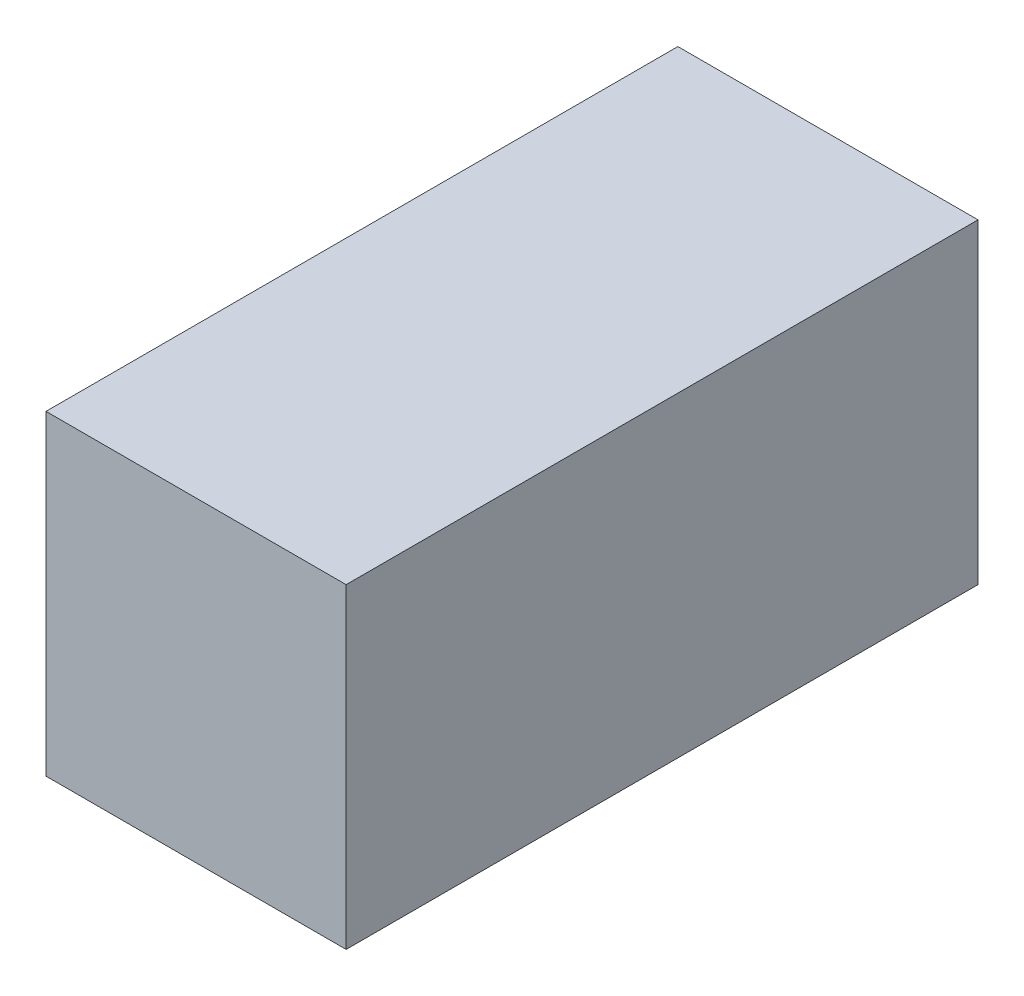
ISO-10303-21;
HEADER;
FILE_DESCRIPTION(('STEP AP214'),'2;1');
FILE_NAME('part.step','',(''),(''),'','','');
FILE_SCHEMA(('AUTOMOTIVE_DESIGN { 1 0 10303 214 1 1 1 1 }'));
ENDSEC;
DATA;
#1=APPLICATION_CONTEXT('core data for automotive mechanical design processes');
#2=APPLICATION_PROTOCOL_DEFINITION('international standard','automotive_design',2000,#1);
#3=PRODUCT_CONTEXT('',#1,'mechanical');
#4=PRODUCT('Part','Part','',(#3));
#5=PRODUCT_RELATED_PRODUCT_CATEGORY('part','',(#4));
#6=PRODUCT_DEFINITION_FORMATION('','',#4);
#7=PRODUCT_DEFINITION_CONTEXT('part definition',#1,'design');
#8=PRODUCT_DEFINITION('design','',#6,#7);
#9=PRODUCT_DEFINITION_SHAPE('','',#8);
#10=(LENGTH_UNIT() NAMED_UNIT(*) SI_UNIT(.MILLI.,.METRE.));
#11=(NAMED_UNIT(*) PLANE_ANGLE_UNIT() SI_UNIT($,.RADIAN.));
#12=(NAMED_UNIT(*) SI_UNIT($,.STERADIAN.) SOLID_ANGLE_UNIT());
#13=UNCERTAINTY_MEASURE_WITH_UNIT(LENGTH_MEASURE(1.E-05),#10,'distance_accuracy_value','');
#14=(GEOMETRIC_REPRESENTATION_CONTEXT(3) GLOBAL_UNCERTAINTY_ASSIGNED_CONTEXT((#13)) GLOBAL_UNIT_ASSIGNED_CONTEXT((#10,
#11,#12)) REPRESENTATION_CONTEXT('',''));
#15=CARTESIAN_POINT('',(0.,0.,0.));
#16=DIRECTION('',(0.,0.,1.));
#17=DIRECTION('',(1.,0.,0.));
#18=AXIS2_PLACEMENT_3D('',#15,#16,#17);
#19=CARTESIAN_POINT('',(-19.,0.,0.));
#20=DIRECTION('',(0.,0.,1.));
#21=DIRECTION('',(1.,0.,0.));
#22=AXIS2_PLACEMENT_3D('',#19,#20,#21);
#23=PLANE('',#22);
#24=DIRECTION('',(0.,-1.,0.));
#25=VECTOR('',#24,1.);
#26=CARTESIAN_POINT('',(0.,0.,0.));
#27=LINE('',#26,#25);
#28=CARTESIAN_POINT('',(0.,20.,0.));
#29=VERTEX_POINT('',#28);
#30=CARTESIAN_POINT('',(0.,0.,0.));
#31=VERTEX_POINT('',#30);
#32=EDGE_CURVE('E104',#29,#31,#27,.T.);
#33=ORIENTED_EDGE('',*,*,#32,.F.);
#34=DIRECTION('',(1.,0.,0.));
#35=VECTOR('',#34,1.);
#36=CARTESIAN_POINT('',(-19.,20.,0.));
#37=LINE('',#36,#35);
#38=CARTESIAN_POINT('',(-19.,20.,0.));
#39=VERTEX_POINT('',#38);
#40=EDGE_CURVE('E11',#39,#29,#37,.T.);
#41=ORIENTED_EDGE('',*,*,#40,.F.);
#42=DIRECTION('',(0.,-1.,0.));
#43=VECTOR('',#42,1.);
#44=CARTESIAN_POINT('',(-19.,0.,0.));
#45=LINE('',#44,#43);
#46=CARTESIAN_POINT('',(-19.,0.,0.));
#47=VERTEX_POINT('',#46);
#48=EDGE_CURVE('E100',#39,#47,#45,.T.);
#49=ORIENTED_EDGE('',*,*,#48,.T.);
#50=DIRECTION('',(1.,0.,0.));
#51=VECTOR('',#50,1.);
#52=CARTESIAN_POINT('',(-19.,0.,0.));
#53=LINE('',#52,#51);
#54=EDGE_CURVE('E45',#47,#31,#53,.T.);
#55=ORIENTED_EDGE('',*,*,#54,.T.);
#56=EDGE_LOOP('',(#33,#41,#49,#55));
#57=FACE_BOUND('',#56,.T.);
#58=ADVANCED_FACE('F39',(#57),#23,.T.);
#59=CARTESIAN_POINT('',(-19.,20.,0.));
#60=DIRECTION('',(0.,1.,0.));
#61=DIRECTION('',(0.,0.,1.));
#62=AXIS2_PLACEMENT_3D('',#59,#60,#61);
#63=PLANE('',#62);
#64=DIRECTION('',(0.,0.,1.));
#65=VECTOR('',#64,1.);
#66=CARTESIAN_POINT('',(0.,20.,0.));
#67=LINE('',#66,#65);
#68=CARTESIAN_POINT('',(0.,20.,-40.));
#69=VERTEX_POINT('',#68);
#70=EDGE_CURVE('E98',#69,#29,#67,.T.);
#71=ORIENTED_EDGE('',*,*,#70,.F.);
#72=DIRECTION('',(1.,0.,0.));
#73=VECTOR('',#72,1.);
#74=CARTESIAN_POINT('',(-19.,20.,-40.));
#75=LINE('',#74,#73);
#76=CARTESIAN_POINT('',(-19.,20.,-40.));
#77=VERTEX_POINT('',#76);
#78=EDGE_CURVE('E48',#77,#69,#75,.T.);
#79=ORIENTED_EDGE('',*,*,#78,.F.);
#80=DIRECTION('',(0.,0.,1.));
#81=VECTOR('',#80,1.);
#82=CARTESIAN_POINT('',(-19.,20.,0.));
#83=LINE('',#82,#81);
#84=EDGE_CURVE('E92',#77,#39,#83,.T.);
#85=ORIENTED_EDGE('',*,*,#84,.T.);
#86=ORIENTED_EDGE('',*,*,#40,.T.);
#87=EDGE_LOOP('',(#71,#79,#85,#86));
#88=FACE_BOUND('',#87,.T.);
#89=ADVANCED_FACE('F111',(#88),#63,.T.);
#90=CARTESIAN_POINT('',(-19.,0.,-40.));
#91=DIRECTION('',(0.,0.,-1.));
#92=DIRECTION('',(-1.,0.,0.));
#93=AXIS2_PLACEMENT_3D('',#90,#91,#92);
#94=PLANE('',#93);
#95=DIRECTION('',(0.,1.,0.));
#96=VECTOR('',#95,1.);
#97=CARTESIAN_POINT('',(0.,0.,-40.));
#98=LINE('',#97,#96);
#99=CARTESIAN_POINT('',(0.,0.,-40.));
#100=VERTEX_POINT('',#99);
#101=EDGE_CURVE('E87',#100,#69,#98,.T.);
#102=ORIENTED_EDGE('',*,*,#101,.F.);
#103=DIRECTION('',(1.,0.,0.));
#104=VECTOR('',#103,1.);
#105=CARTESIAN_POINT('',(-19.,0.,-40.));
#106=LINE('',#105,#104);
#107=CARTESIAN_POINT('',(-19.,0.,-40.));
#108=VERTEX_POINT('',#107);
#109=EDGE_CURVE('E84',#108,#100,#106,.T.);
#110=ORIENTED_EDGE('',*,*,#109,.F.);
#111=DIRECTION('',(0.,1.,0.));
#112=VECTOR('',#111,1.);
#113=CARTESIAN_POINT('',(-19.,0.,-40.));
#114=LINE('',#113,#112);
#115=EDGE_CURVE('E90',#108,#77,#114,.T.);
#116=ORIENTED_EDGE('',*,*,#115,.T.);
#117=ORIENTED_EDGE('',*,*,#78,.T.);
#118=EDGE_LOOP('',(#102,#110,#116,#117));
#119=FACE_BOUND('',#118,.T.);
#120=ADVANCED_FACE('F86',(#119),#94,.T.);
#121=CARTESIAN_POINT('',(-19.,0.,0.));
#122=DIRECTION('',(0.,-1.,0.));
#123=DIRECTION('',(0.,0.,-1.));
#124=AXIS2_PLACEMENT_3D('',#121,#122,#123);
#125=PLANE('',#124);
#126=DIRECTION('',(0.,0.,-1.));
#127=VECTOR('',#126,1.);
#128=CARTESIAN_POINT('',(0.,0.,0.));
#129=LINE('',#128,#127);
#130=EDGE_CURVE('E106',#31,#100,#129,.T.);
#131=ORIENTED_EDGE('',*,*,#130,.F.);
#132=ORIENTED_EDGE('',*,*,#54,.F.);
#133=DIRECTION('',(0.,0.,-1.));
#134=VECTOR('',#133,1.);
#135=CARTESIAN_POINT('',(-19.,0.,0.));
#136=LINE('',#135,#134);
#137=EDGE_CURVE('E93',#47,#108,#136,.T.);
#138=ORIENTED_EDGE('',*,*,#137,.T.);
#139=ORIENTED_EDGE('',*,*,#109,.T.);
#140=EDGE_LOOP('',(#131,#132,#138,#139));
#141=FACE_BOUND('',#140,.T.);
#142=ADVANCED_FACE('F96',(#141),#125,.T.);
#143=CARTESIAN_POINT('',(-19.,0.,0.));
#144=DIRECTION('',(-1.,0.,0.));
#145=DIRECTION('',(0.,0.,1.));
#146=AXIS2_PLACEMENT_3D('',#143,#144,#145);
#147=PLANE('',#146);
#148=ORIENTED_EDGE('',*,*,#48,.F.);
#149=ORIENTED_EDGE('',*,*,#84,.F.);
#150=ORIENTED_EDGE('',*,*,#115,.F.);
#151=ORIENTED_EDGE('',*,*,#137,.F.);
#152=EDGE_LOOP('',(#148,#149,#150,#151));
#153=FACE_BOUND('',#152,.T.);
#154=ADVANCED_FACE('F95',(#153),#147,.T.);
#155=CARTESIAN_POINT('',(0.,0.,0.));
#156=DIRECTION('',(-1.,0.,0.));
#157=DIRECTION('',(0.,0.,1.));
#158=AXIS2_PLACEMENT_3D('',#155,#156,#157);
#159=PLANE('',#158);
#160=ORIENTED_EDGE('',*,*,#32,.T.);
#161=ORIENTED_EDGE('',*,*,#130,.T.);
#162=ORIENTED_EDGE('',*,*,#101,.T.);
#163=ORIENTED_EDGE('',*,*,#70,.T.);
#164=EDGE_LOOP('',(#160,#161,#162,#163));
#165=FACE_BOUND('',#164,.T.);
#166=ADVANCED_FACE('F115',(#165),#159,.F.);
#167=CLOSED_SHELL('',(#58,#89,#120,#142,#154,#166));
#168=MANIFOLD_SOLID_BREP('B2',#167);
#169=ADVANCED_BREP_SHAPE_REPRESENTATION('',(#18,#168),#14);
#170=SHAPE_DEFINITION_REPRESENTATION(#9,#169);
ENDSEC;
END-ISO-10303-21;
